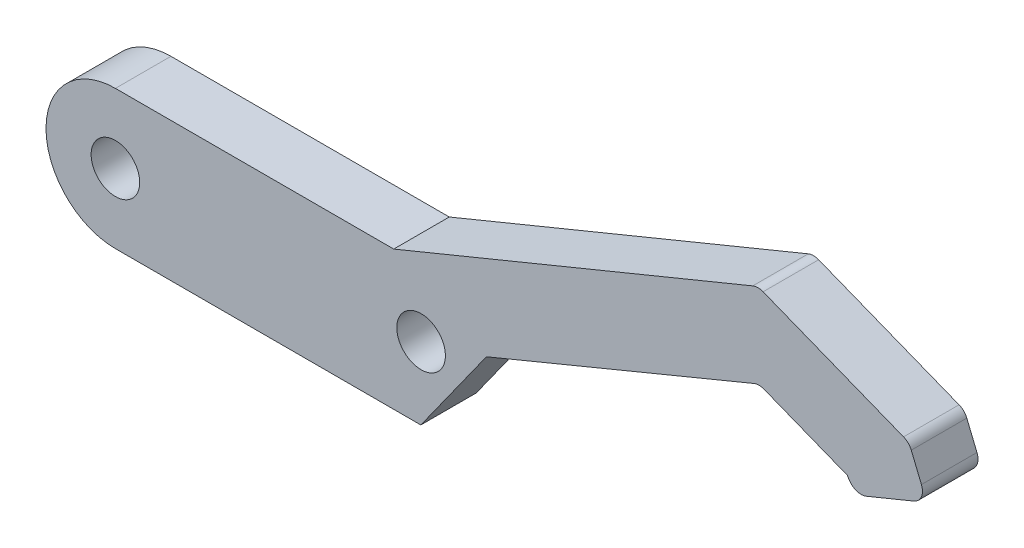
ISO-10303-21;
HEADER;
FILE_DESCRIPTION(('STEP AP214'),'2;1');
FILE_NAME('part.step','',(''),(''),'','','');
FILE_SCHEMA(('AUTOMOTIVE_DESIGN { 1 0 10303 214 1 1 1 1 }'));
ENDSEC;
DATA;
#1=APPLICATION_CONTEXT('core data for automotive mechanical design processes');
#2=APPLICATION_PROTOCOL_DEFINITION('international standard','automotive_design',2000,#1);
#3=PRODUCT_CONTEXT('',#1,'mechanical');
#4=PRODUCT('Part','Part','',(#3));
#5=PRODUCT_RELATED_PRODUCT_CATEGORY('part','',(#4));
#6=PRODUCT_DEFINITION_FORMATION('','',#4);
#7=PRODUCT_DEFINITION_CONTEXT('part definition',#1,'design');
#8=PRODUCT_DEFINITION('design','',#6,#7);
#9=PRODUCT_DEFINITION_SHAPE('','',#8);
#10=(LENGTH_UNIT() NAMED_UNIT(*) SI_UNIT(.MILLI.,.METRE.));
#11=(NAMED_UNIT(*) PLANE_ANGLE_UNIT() SI_UNIT($,.RADIAN.));
#12=(NAMED_UNIT(*) SI_UNIT($,.STERADIAN.) SOLID_ANGLE_UNIT());
#13=UNCERTAINTY_MEASURE_WITH_UNIT(LENGTH_MEASURE(1.E-05),#10,'distance_accuracy_value','');
#14=(GEOMETRIC_REPRESENTATION_CONTEXT(3) GLOBAL_UNCERTAINTY_ASSIGNED_CONTEXT((#13)) GLOBAL_UNIT_ASSIGNED_CONTEXT((#10,
#11,#12)) REPRESENTATION_CONTEXT('',''));
#15=CARTESIAN_POINT('',(0.,0.,0.));
#16=DIRECTION('',(0.,0.,1.));
#17=DIRECTION('',(1.,0.,0.));
#18=AXIS2_PLACEMENT_3D('',#15,#16,#17);
#19=CARTESIAN_POINT('',(16.934362430617,-12.0934009893302,4.));
#20=DIRECTION('',(0.81379193013563,-0.581156342515615,0.));
#21=DIRECTION('',(0.581156342515615,0.81379193013563,0.));
#22=AXIS2_PLACEMENT_3D('',#19,#20,#21);
#23=PLANE('',#22);
#24=DIRECTION('',(-0.581156342515615,-0.81379193013563,0.));
#25=VECTOR('',#24,1.);
#26=CARTESIAN_POINT('',(16.934362430617,-12.0934009893302,0.));
#27=LINE('',#26,#25);
#28=CARTESIAN_POINT('',(26.7294034168635,1.62257305553869,0.));
#29=VERTEX_POINT('',#28);
#30=CARTESIAN_POINT('',(22.,-5.,0.));
#31=VERTEX_POINT('',#30);
#32=EDGE_CURVE('E169',#29,#31,#27,.T.);
#33=ORIENTED_EDGE('',*,*,#32,.F.);
#34=DIRECTION('',(0.,0.,-1.));
#35=VECTOR('',#34,1.);
#36=CARTESIAN_POINT('',(26.7294034168635,1.62257305553869,4.));
#37=LINE('',#36,#35);
#38=CARTESIAN_POINT('',(26.7294034168635,1.62257305553869,4.));
#39=VERTEX_POINT('',#38);
#40=EDGE_CURVE('E157',#39,#29,#37,.T.);
#41=ORIENTED_EDGE('',*,*,#40,.F.);
#42=DIRECTION('',(-0.581156342515615,-0.81379193013563,0.));
#43=VECTOR('',#42,1.);
#44=CARTESIAN_POINT('',(16.934362430617,-12.0934009893302,4.));
#45=LINE('',#44,#43);
#46=CARTESIAN_POINT('',(22.,-5.,4.));
#47=VERTEX_POINT('',#46);
#48=EDGE_CURVE('E164',#39,#47,#45,.T.);
#49=ORIENTED_EDGE('',*,*,#48,.T.);
#50=DIRECTION('',(0.,0.,-1.));
#51=VECTOR('',#50,1.);
#52=CARTESIAN_POINT('',(22.,-5.,4.));
#53=LINE('',#52,#51);
#54=EDGE_CURVE('E207',#47,#31,#53,.T.);
#55=ORIENTED_EDGE('',*,*,#54,.T.);
#56=EDGE_LOOP('',(#33,#41,#49,#55));
#57=FACE_BOUND('',#56,.T.);
#58=ADVANCED_FACE('F35',(#57),#23,.T.);
#59=CARTESIAN_POINT('',(3.32722644666791,-8.05000728041563,4.));
#60=DIRECTION('',(0.381978201381876,-0.924171333503192,0.));
#61=DIRECTION('',(0.924171333503192,0.381978201381876,0.));
#62=AXIS2_PLACEMENT_3D('',#59,#60,#61);
#63=PLANE('',#62);
#64=DIRECTION('',(-0.924171333503192,-0.381978201381876,0.));
#65=VECTOR('',#64,1.);
#66=CARTESIAN_POINT('',(3.32722644666791,-8.05000728041563,0.));
#67=LINE('',#66,#65);
#68=CARTESIAN_POINT('',(45.9854130845709,9.58146084183411,0.));
#69=VERTEX_POINT('',#68);
#70=EDGE_CURVE('E209',#69,#29,#67,.T.);
#71=ORIENTED_EDGE('',*,*,#70,.F.);
#72=DIRECTION('',(0.,0.,-1.));
#73=VECTOR('',#72,1.);
#74=CARTESIAN_POINT('',(45.9854130845709,9.5814608418341,4.));
#75=LINE('',#74,#73);
#76=CARTESIAN_POINT('',(45.9854130845709,9.58146084183411,4.));
#77=VERTEX_POINT('',#76);
#78=EDGE_CURVE('E160',#69,#77,#75,.F.);
#79=ORIENTED_EDGE('',*,*,#78,.T.);
#80=DIRECTION('',(-0.924171333503192,-0.381978201381876,0.));
#81=VECTOR('',#80,1.);
#82=CARTESIAN_POINT('',(3.32722644666791,-8.05000728041563,4.));
#83=LINE('',#82,#81);
#84=EDGE_CURVE('E153',#77,#39,#83,.T.);
#85=ORIENTED_EDGE('',*,*,#84,.T.);
#86=ORIENTED_EDGE('',*,*,#40,.T.);
#87=EDGE_LOOP('',(#71,#79,#85,#86));
#88=FACE_BOUND('',#87,.T.);
#89=ADVANCED_FACE('F156',(#88),#63,.T.);
#90=CARTESIAN_POINT('',(9.576537290638,24.2571481525365,4.));
#91=DIRECTION('',(-0.367211229440493,-0.930137577443682,0.));
#92=DIRECTION('',(0.930137577443682,-0.367211229440493,0.));
#93=AXIS2_PLACEMENT_3D('',#90,#91,#92);
#94=PLANE('',#93);
#95=DIRECTION('',(-0.930137577443682,0.367211229440493,0.));
#96=VECTOR('',#95,1.);
#97=CARTESIAN_POINT('',(9.576537290638,24.2571481525365,4.));
#98=LINE('',#97,#96);
#99=CARTESIAN_POINT('',(52.7187610514864,7.22492688527212,4.));
#100=VERTEX_POINT('',#99);
#101=CARTESIAN_POINT('',(46.7346025153933,9.58742708577459,4.));
#102=VERTEX_POINT('',#101);
#103=EDGE_CURVE('E163',#100,#102,#98,.T.);
#104=ORIENTED_EDGE('',*,*,#103,.T.);
#105=DIRECTION('',(0.,0.,-1.));
#106=VECTOR('',#105,1.);
#107=CARTESIAN_POINT('',(46.7346025153933,9.5874270857746,0.));
#108=LINE('',#107,#106);
#109=CARTESIAN_POINT('',(46.7346025153933,9.58742708577459,0.));
#110=VERTEX_POINT('',#109);
#111=EDGE_CURVE('E170',#102,#110,#108,.T.);
#112=ORIENTED_EDGE('',*,*,#111,.T.);
#113=DIRECTION('',(-0.930137577443682,0.367211229440493,0.));
#114=VECTOR('',#113,1.);
#115=CARTESIAN_POINT('',(9.576537290638,24.2571481525365,0.));
#116=LINE('',#115,#114);
#117=CARTESIAN_POINT('',(52.7187610514864,7.22492688527212,0.));
#118=VERTEX_POINT('',#117);
#119=EDGE_CURVE('E211',#118,#110,#116,.T.);
#120=ORIENTED_EDGE('',*,*,#119,.F.);
#121=DIRECTION('',(0.,0.,-1.));
#122=VECTOR('',#121,1.);
#123=CARTESIAN_POINT('',(52.7187610514864,7.22492688527212,4.));
#124=LINE('',#123,#122);
#125=EDGE_CURVE('E171',#100,#118,#124,.T.);
#126=ORIENTED_EDGE('',*,*,#125,.F.);
#127=EDGE_LOOP('',(#104,#112,#120,#126));
#128=FACE_BOUND('',#127,.T.);
#129=ADVANCED_FACE('F316',(#128),#94,.T.);
#130=CARTESIAN_POINT('',(40.3231703772144,26.2593044322589,4.));
#131=DIRECTION('',(0.837975692706987,0.545707557609609,0.));
#132=DIRECTION('',(-0.545707557609609,0.837975692706987,0.));
#133=AXIS2_PLACEMENT_3D('',#130,#131,#132);
#134=PLANE('',#133);
#135=DIRECTION('',(0.545707557609609,-0.837975692706987,0.));
#136=VECTOR('',#135,1.);
#137=CARTESIAN_POINT('',(40.3231703772144,26.2593044322589,0.));
#138=LINE('',#137,#136);
#139=CARTESIAN_POINT('',(52.8776413501902,6.98095403478241,0.));
#140=VERTEX_POINT('',#139);
#141=EDGE_CURVE('E214',#118,#140,#138,.T.);
#142=ORIENTED_EDGE('',*,*,#141,.T.);
#143=DIRECTION('',(0.,0.,-1.));
#144=VECTOR('',#143,1.);
#145=CARTESIAN_POINT('',(52.8776413501902,6.98095403478241,4.));
#146=LINE('',#145,#144);
#147=CARTESIAN_POINT('',(52.8776413501902,6.98095403478241,4.));
#148=VERTEX_POINT('',#147);
#149=EDGE_CURVE('E254',#140,#148,#146,.F.);
#150=ORIENTED_EDGE('',*,*,#149,.T.);
#151=DIRECTION('',(0.545707557609609,-0.837975692706987,0.));
#152=VECTOR('',#151,1.);
#153=CARTESIAN_POINT('',(40.3231703772144,26.2593044322589,4.));
#154=LINE('',#153,#152);
#155=EDGE_CURVE('E188',#100,#148,#154,.T.);
#156=ORIENTED_EDGE('',*,*,#155,.F.);
#157=ORIENTED_EDGE('',*,*,#125,.T.);
#158=EDGE_LOOP('',(#142,#150,#156,#157));
#159=FACE_BOUND('',#158,.T.);
#160=ADVANCED_FACE('F363',(#159),#134,.F.);
#161=CARTESIAN_POINT('',(5.50044882078671,-13.3782141251102,4.));
#162=DIRECTION('',(0.380263412733206,-0.924878228166549,0.));
#163=DIRECTION('',(0.924878228166549,0.380263412733206,0.));
#164=AXIS2_PLACEMENT_3D('',#161,#162,#163);
#165=PLANE('',#164);
#166=DIRECTION('',(-0.924878228166549,-0.380263412733206,0.));
#167=VECTOR('',#166,1.);
#168=CARTESIAN_POINT('',(5.50044882078671,-13.3782141251102,4.));
#169=LINE('',#168,#167);
#170=CARTESIAN_POINT('',(57.5184576308977,8.0089749678055,4.));
#171=VERTEX_POINT('',#170);
#172=CARTESIAN_POINT('',(54.0958804556304,6.60178336422548,4.));
#173=VERTEX_POINT('',#172);
#174=EDGE_CURVE('E191',#171,#173,#169,.T.);
#175=ORIENTED_EDGE('',*,*,#174,.T.);
#176=DIRECTION('',(0.,0.,-1.));
#177=VECTOR('',#176,1.);
#178=CARTESIAN_POINT('',(54.0958804556304,6.60178336422547,0.));
#179=LINE('',#178,#177);
#180=CARTESIAN_POINT('',(54.0958804556304,6.60178336422548,0.));
#181=VERTEX_POINT('',#180);
#182=EDGE_CURVE('E247',#173,#181,#179,.T.);
#183=ORIENTED_EDGE('',*,*,#182,.T.);
#184=DIRECTION('',(-0.924878228166549,-0.380263412733206,0.));
#185=VECTOR('',#184,1.);
#186=CARTESIAN_POINT('',(5.50044882078671,-13.3782141251102,0.));
#187=LINE('',#186,#185);
#188=CARTESIAN_POINT('',(57.5184576308977,8.0089749678055,0.));
#189=VERTEX_POINT('',#188);
#190=EDGE_CURVE('E217',#189,#181,#187,.T.);
#191=ORIENTED_EDGE('',*,*,#190,.F.);
#192=DIRECTION('',(0.,0.,-1.));
#193=VECTOR('',#192,1.);
#194=CARTESIAN_POINT('',(57.5184576308977,8.0089749678055,4.));
#195=LINE('',#194,#193);
#196=EDGE_CURVE('E245',#189,#171,#195,.F.);
#197=ORIENTED_EDGE('',*,*,#196,.T.);
#198=EDGE_LOOP('',(#175,#183,#191,#197));
#199=FACE_BOUND('',#198,.T.);
#200=ADVANCED_FACE('F370',(#199),#165,.T.);
#201=CARTESIAN_POINT('',(52.9428870382775,21.767452505649,4.));
#202=DIRECTION('',(0.924878228166549,0.380263412733207,0.));
#203=DIRECTION('',(-0.380263412733207,0.924878228166549,0.));
#204=AXIS2_PLACEMENT_3D('',#201,#202,#203);
#205=PLANE('',#204);
#206=DIRECTION('',(0.380263412733207,-0.924878228166549,0.));
#207=VECTOR('',#206,1.);
#208=CARTESIAN_POINT('',(52.9428870382775,21.767452505649,0.));
#209=LINE('',#208,#207);
#210=CARTESIAN_POINT('',(57.3308590728285,11.0950089713373,0.));
#211=VERTEX_POINT('',#210);
#212=CARTESIAN_POINT('',(58.0630724463311,9.31411660870525,0.));
#213=VERTEX_POINT('',#212);
#214=EDGE_CURVE('E220',#211,#213,#209,.T.);
#215=ORIENTED_EDGE('',*,*,#214,.F.);
#216=DIRECTION('',(0.,0.,-1.));
#217=VECTOR('',#216,1.);
#218=CARTESIAN_POINT('',(57.3308590728285,11.0950089713373,4.));
#219=LINE('',#218,#217);
#220=CARTESIAN_POINT('',(57.3308590728285,11.0950089713373,4.));
#221=VERTEX_POINT('',#220);
#222=EDGE_CURVE('E60',#211,#221,#219,.F.);
#223=ORIENTED_EDGE('',*,*,#222,.T.);
#224=DIRECTION('',(0.380263412733207,-0.924878228166549,0.));
#225=VECTOR('',#224,1.);
#226=CARTESIAN_POINT('',(52.9428870382775,21.767452505649,4.));
#227=LINE('',#226,#225);
#228=CARTESIAN_POINT('',(58.0630724463311,9.31411660870525,4.));
#229=VERTEX_POINT('',#228);
#230=EDGE_CURVE('E194',#221,#229,#227,.T.);
#231=ORIENTED_EDGE('',*,*,#230,.T.);
#232=DIRECTION('',(0.,0.,-1.));
#233=VECTOR('',#232,1.);
#234=CARTESIAN_POINT('',(58.0630724463311,9.31411660870525,4.));
#235=LINE('',#234,#233);
#236=EDGE_CURVE('E261',#229,#213,#235,.T.);
#237=ORIENTED_EDGE('',*,*,#236,.T.);
#238=EDGE_LOOP('',(#215,#223,#231,#237));
#239=FACE_BOUND('',#238,.T.);
#240=ADVANCED_FACE('F375',(#239),#205,.T.);
#241=CARTESIAN_POINT('',(11.6329201755047,29.465918586221,4.));
#242=DIRECTION('',(0.367211229440492,0.930137577443683,0.));
#243=DIRECTION('',(-0.930137577443683,0.367211229440492,0.));
#244=AXIS2_PLACEMENT_3D('',#241,#242,#243);
#245=PLANE('',#244);
#246=DIRECTION('',(0.930137577443683,-0.367211229440492,0.));
#247=VECTOR('',#246,1.);
#248=CARTESIAN_POINT('',(11.6329201755047,29.465918586221,4.));
#249=LINE('',#248,#247);
#250=CARTESIAN_POINT('',(46.6585920111069,15.6380501841303,4.));
#251=VERTEX_POINT('',#250);
#252=CARTESIAN_POINT('',(56.7731920741024,11.6448831360478,4.));
#253=VERTEX_POINT('',#252);
#254=EDGE_CURVE('E196',#251,#253,#249,.T.);
#255=ORIENTED_EDGE('',*,*,#254,.T.);
#256=DIRECTION('',(0.,0.,-1.));
#257=VECTOR('',#256,1.);
#258=CARTESIAN_POINT('',(56.7731920741024,11.6448831360478,4.));
#259=LINE('',#258,#257);
#260=CARTESIAN_POINT('',(56.7731920741024,11.6448831360478,0.));
#261=VERTEX_POINT('',#260);
#262=EDGE_CURVE('E270',#253,#261,#259,.T.);
#263=ORIENTED_EDGE('',*,*,#262,.T.);
#264=DIRECTION('',(0.930137577443683,-0.367211229440492,0.));
#265=VECTOR('',#264,1.);
#266=CARTESIAN_POINT('',(11.6329201755047,29.465918586221,0.));
#267=LINE('',#266,#265);
#268=CARTESIAN_POINT('',(46.6585920111069,15.6380501841303,0.));
#269=VERTEX_POINT('',#268);
#270=EDGE_CURVE('E222',#269,#261,#267,.T.);
#271=ORIENTED_EDGE('',*,*,#270,.F.);
#272=DIRECTION('',(0.,0.,-1.));
#273=VECTOR('',#272,1.);
#274=CARTESIAN_POINT('',(46.6585920111069,15.6380501841303,4.));
#275=LINE('',#274,#273);
#276=EDGE_CURVE('E268',#269,#251,#275,.F.);
#277=ORIENTED_EDGE('',*,*,#276,.T.);
#278=EDGE_LOOP('',(#255,#263,#271,#277));
#279=FACE_BOUND('',#278,.T.);
#280=ADVANCED_FACE('F340',(#279),#245,.T.);
#281=CARTESIAN_POINT('',(1.14074851739701,-2.77453321099285,4.));
#282=DIRECTION('',(-0.380263412733207,0.924878228166549,0.));
#283=DIRECTION('',(-0.924878228166549,-0.380263412733207,0.));
#284=AXIS2_PLACEMENT_3D('',#281,#282,#283);
#285=PLANE('',#284);
#286=DIRECTION('',(0.924878228166549,0.380263412733207,0.));
#287=VECTOR('',#286,1.);
#288=CARTESIAN_POINT('',(1.14074851739701,-2.77453321099285,4.));
#289=LINE('',#288,#287);
#290=CARTESIAN_POINT('',(20.05,5.,4.));
#291=VERTEX_POINT('',#290);
#292=CARTESIAN_POINT('',(45.9111173689332,15.6327908348532,4.));
#293=VERTEX_POINT('',#292);
#294=EDGE_CURVE('E199',#291,#293,#289,.T.);
#295=ORIENTED_EDGE('',*,*,#294,.T.);
#296=DIRECTION('',(0.,0.,-1.));
#297=VECTOR('',#296,1.);
#298=CARTESIAN_POINT('',(45.9111173689332,15.6327908348532,4.));
#299=LINE('',#298,#297);
#300=CARTESIAN_POINT('',(45.9111173689332,15.6327908348532,0.));
#301=VERTEX_POINT('',#300);
#302=EDGE_CURVE('E11',#293,#301,#299,.T.);
#303=ORIENTED_EDGE('',*,*,#302,.T.);
#304=DIRECTION('',(0.924878228166549,0.380263412733207,0.));
#305=VECTOR('',#304,1.);
#306=CARTESIAN_POINT('',(1.14074851739701,-2.77453321099285,0.));
#307=LINE('',#306,#305);
#308=CARTESIAN_POINT('',(20.05,5.,0.));
#309=VERTEX_POINT('',#308);
#310=EDGE_CURVE('E225',#309,#301,#307,.T.);
#311=ORIENTED_EDGE('',*,*,#310,.F.);
#312=DIRECTION('',(0.,0.,-1.));
#313=VECTOR('',#312,1.);
#314=CARTESIAN_POINT('',(20.05,5.,4.));
#315=LINE('',#314,#313);
#316=EDGE_CURVE('E239',#291,#309,#315,.T.);
#317=ORIENTED_EDGE('',*,*,#316,.F.);
#318=EDGE_LOOP('',(#295,#303,#311,#317));
#319=FACE_BOUND('',#318,.T.);
#320=ADVANCED_FACE('F346',(#319),#285,.T.);
#321=CARTESIAN_POINT('',(0.,5.,4.));
#322=DIRECTION('',(0.,1.,0.));
#323=DIRECTION('',(-1.,0.,0.));
#324=AXIS2_PLACEMENT_3D('',#321,#322,#323);
#325=PLANE('',#324);
#326=DIRECTION('',(1.,0.,0.));
#327=VECTOR('',#326,1.);
#328=CARTESIAN_POINT('',(0.,5.,0.));
#329=LINE('',#328,#327);
#330=CARTESIAN_POINT('',(0.,5.,0.));
#331=VERTEX_POINT('',#330);
#332=EDGE_CURVE('E228',#331,#309,#329,.T.);
#333=ORIENTED_EDGE('',*,*,#332,.F.);
#334=DIRECTION('',(0.,0.,-1.));
#335=VECTOR('',#334,1.);
#336=CARTESIAN_POINT('',(0.,5.,4.));
#337=LINE('',#336,#335);
#338=CARTESIAN_POINT('',(0.,5.,4.));
#339=VERTEX_POINT('',#338);
#340=EDGE_CURVE('E237',#339,#331,#337,.T.);
#341=ORIENTED_EDGE('',*,*,#340,.F.);
#342=DIRECTION('',(1.,0.,0.));
#343=VECTOR('',#342,1.);
#344=CARTESIAN_POINT('',(0.,5.,4.));
#345=LINE('',#344,#343);
#346=EDGE_CURVE('E201',#339,#291,#345,.T.);
#347=ORIENTED_EDGE('',*,*,#346,.T.);
#348=ORIENTED_EDGE('',*,*,#316,.T.);
#349=EDGE_LOOP('',(#333,#341,#347,#348));
#350=FACE_BOUND('',#349,.T.);
#351=ADVANCED_FACE('F351',(#350),#325,.T.);
#352=CARTESIAN_POINT('',(0.,0.,4.));
#353=DIRECTION('',(0.,0.,-1.));
#354=DIRECTION('',(-1.,0.,0.));
#355=AXIS2_PLACEMENT_3D('',#352,#353,#354);
#356=CYLINDRICAL_SURFACE('',#355,5.);
#357=CARTESIAN_POINT('',(0.,0.,0.));
#358=DIRECTION('',(0.,0.,1.));
#359=DIRECTION('',(1.,0.,0.));
#360=AXIS2_PLACEMENT_3D('',#357,#358,#359);
#361=CIRCLE('',#360,5.);
#362=CARTESIAN_POINT('',(0.,-5.,0.));
#363=VERTEX_POINT('',#362);
#364=EDGE_CURVE('E180',#331,#363,#361,.T.);
#365=ORIENTED_EDGE('',*,*,#364,.T.);
#366=DIRECTION('',(0.,0.,-1.));
#367=VECTOR('',#366,1.);
#368=CARTESIAN_POINT('',(0.,-5.,4.));
#369=LINE('',#368,#367);
#370=CARTESIAN_POINT('',(0.,-5.,4.));
#371=VERTEX_POINT('',#370);
#372=EDGE_CURVE('E234',#371,#363,#369,.T.);
#373=ORIENTED_EDGE('',*,*,#372,.F.);
#374=CARTESIAN_POINT('',(0.,0.,4.));
#375=DIRECTION('',(0.,0.,1.));
#376=DIRECTION('',(1.,0.,0.));
#377=AXIS2_PLACEMENT_3D('',#374,#375,#376);
#378=CIRCLE('',#377,5.);
#379=EDGE_CURVE('E204',#339,#371,#378,.T.);
#380=ORIENTED_EDGE('',*,*,#379,.F.);
#381=ORIENTED_EDGE('',*,*,#340,.T.);
#382=EDGE_LOOP('',(#365,#373,#380,#381));
#383=FACE_BOUND('',#382,.T.);
#384=ADVANCED_FACE('F307',(#383),#356,.T.);
#385=CARTESIAN_POINT('',(0.,-5.,4.));
#386=DIRECTION('',(0.,1.,0.));
#387=DIRECTION('',(-1.,0.,0.));
#388=AXIS2_PLACEMENT_3D('',#385,#386,#387);
#389=PLANE('',#388);
#390=DIRECTION('',(1.,0.,0.));
#391=VECTOR('',#390,1.);
#392=CARTESIAN_POINT('',(0.,-5.,0.));
#393=LINE('',#392,#391);
#394=EDGE_CURVE('E177',#363,#31,#393,.T.);
#395=ORIENTED_EDGE('',*,*,#394,.T.);
#396=ORIENTED_EDGE('',*,*,#54,.F.);
#397=DIRECTION('',(1.,0.,0.));
#398=VECTOR('',#397,1.);
#399=CARTESIAN_POINT('',(0.,-5.,4.));
#400=LINE('',#399,#398);
#401=EDGE_CURVE('E175',#371,#47,#400,.T.);
#402=ORIENTED_EDGE('',*,*,#401,.F.);
#403=ORIENTED_EDGE('',*,*,#372,.T.);
#404=EDGE_LOOP('',(#395,#396,#402,#403));
#405=FACE_BOUND('',#404,.T.);
#406=ADVANCED_FACE('F296',(#405),#389,.F.);
#407=CARTESIAN_POINT('',(0.,0.,4.));
#408=DIRECTION('',(0.,0.,1.));
#409=DIRECTION('',(1.,0.,0.));
#410=AXIS2_PLACEMENT_3D('',#407,#408,#409);
#411=PLANE('',#410);
#412=CARTESIAN_POINT('',(22.0207052746916,0.206842568432915,4.));
#413=DIRECTION('',(0.,0.,1.));
#414=DIRECTION('',(1.,0.,0.));
#415=AXIS2_PLACEMENT_3D('',#412,#413,#414);
#416=CIRCLE('',#415,1.75);
#417=CARTESIAN_POINT('',(23.7707052746916,0.206842568432915,4.));
#418=VERTEX_POINT('',#417);
#419=EDGE_CURVE('E281',#418,#418,#416,.T.);
#420=ORIENTED_EDGE('',*,*,#419,.F.);
#421=EDGE_LOOP('',(#420));
#422=FACE_BOUND('',#421,.T.);
#423=CARTESIAN_POINT('',(0.,0.,4.));
#424=DIRECTION('',(0.,0.,1.));
#425=DIRECTION('',(1.,0.,0.));
#426=AXIS2_PLACEMENT_3D('',#423,#424,#425);
#427=CIRCLE('',#426,1.75);
#428=CARTESIAN_POINT('',(1.75,0.,4.));
#429=VERTEX_POINT('',#428);
#430=EDGE_CURVE('E183',#429,#429,#427,.T.);
#431=ORIENTED_EDGE('',*,*,#430,.F.);
#432=EDGE_LOOP('',(#431));
#433=FACE_BOUND('',#432,.T.);
#434=ORIENTED_EDGE('',*,*,#230,.F.);
#435=CARTESIAN_POINT('',(56.4059808446619,10.7147455586041,4.));
#436=DIRECTION('',(0.,0.,1.));
#437=DIRECTION('',(1.,0.,0.));
#438=AXIS2_PLACEMENT_3D('',#435,#436,#437);
#439=CIRCLE('',#438,1.);
#440=EDGE_CURVE('E44',#221,#253,#439,.T.);
#441=ORIENTED_EDGE('',*,*,#440,.T.);
#442=ORIENTED_EDGE('',*,*,#254,.F.);
#443=CARTESIAN_POINT('',(46.2913807816664,14.7079126066866,4.));
#444=DIRECTION('',(0.,0.,1.));
#445=DIRECTION('',(1.,0.,0.));
#446=AXIS2_PLACEMENT_3D('',#443,#444,#445);
#447=CIRCLE('',#446,1.);
#448=EDGE_CURVE('E52',#251,#293,#447,.T.);
#449=ORIENTED_EDGE('',*,*,#448,.T.);
#450=ORIENTED_EDGE('',*,*,#294,.F.);
#451=ORIENTED_EDGE('',*,*,#346,.F.);
#452=ORIENTED_EDGE('',*,*,#379,.T.);
#453=ORIENTED_EDGE('',*,*,#401,.T.);
#454=ORIENTED_EDGE('',*,*,#48,.F.);
#455=ORIENTED_EDGE('',*,*,#84,.F.);
#456=CARTESIAN_POINT('',(46.3673912859528,8.65728950833092,4.));
#457=DIRECTION('',(0.,0.,1.));
#458=DIRECTION('',(1.,0.,0.));
#459=AXIS2_PLACEMENT_3D('',#456,#457,#458);
#460=CIRCLE('',#459,1.);
#461=EDGE_CURVE('E266',#77,#102,#460,.F.);
#462=ORIENTED_EDGE('',*,*,#461,.T.);
#463=ORIENTED_EDGE('',*,*,#103,.F.);
#464=ORIENTED_EDGE('',*,*,#155,.T.);
#465=CARTESIAN_POINT('',(53.7156170428972,7.52666159239202,4.));
#466=DIRECTION('',(0.,0.,1.));
#467=DIRECTION('',(1.,0.,0.));
#468=AXIS2_PLACEMENT_3D('',#465,#466,#467);
#469=CIRCLE('',#468,1.);
#470=EDGE_CURVE('E259',#148,#173,#469,.T.);
#471=ORIENTED_EDGE('',*,*,#470,.T.);
#472=ORIENTED_EDGE('',*,*,#174,.F.);
#473=CARTESIAN_POINT('',(57.1381942181645,8.93385319597205,4.));
#474=DIRECTION('',(0.,0.,1.));
#475=DIRECTION('',(1.,0.,0.));
#476=AXIS2_PLACEMENT_3D('',#473,#474,#475);
#477=CIRCLE('',#476,1.);
#478=EDGE_CURVE('E256',#171,#229,#477,.T.);
#479=ORIENTED_EDGE('',*,*,#478,.T.);
#480=EDGE_LOOP('',(#434,#441,#442,#449,#450,#451,#452,#453,#454,#455,#462,#463,#464,#471,#472,#479));
#481=FACE_BOUND('',#480,.T.);
#482=ADVANCED_FACE('F173',(#422,#433,#481),#411,.T.);
#483=CARTESIAN_POINT('',(0.,0.,0.));
#484=DIRECTION('',(0.,0.,1.));
#485=DIRECTION('',(1.,0.,0.));
#486=AXIS2_PLACEMENT_3D('',#483,#484,#485);
#487=PLANE('',#486);
#488=CARTESIAN_POINT('',(22.0207052746916,0.206842568432915,0.));
#489=DIRECTION('',(0.,0.,1.));
#490=DIRECTION('',(1.,0.,0.));
#491=AXIS2_PLACEMENT_3D('',#488,#489,#490);
#492=CIRCLE('',#491,1.75);
#493=CARTESIAN_POINT('',(23.7707052746916,0.206842568432915,0.));
#494=VERTEX_POINT('',#493);
#495=EDGE_CURVE('E39',#494,#494,#492,.T.);
#496=ORIENTED_EDGE('',*,*,#495,.T.);
#497=EDGE_LOOP('',(#496));
#498=FACE_BOUND('',#497,.T.);
#499=CARTESIAN_POINT('',(0.,0.,0.));
#500=DIRECTION('',(0.,0.,1.));
#501=DIRECTION('',(1.,0.,0.));
#502=AXIS2_PLACEMENT_3D('',#499,#500,#501);
#503=CIRCLE('',#502,1.75);
#504=CARTESIAN_POINT('',(1.75,0.,0.));
#505=VERTEX_POINT('',#504);
#506=EDGE_CURVE('E279',#505,#505,#503,.T.);
#507=ORIENTED_EDGE('',*,*,#506,.T.);
#508=EDGE_LOOP('',(#507));
#509=FACE_BOUND('',#508,.T.);
#510=ORIENTED_EDGE('',*,*,#270,.T.);
#511=CARTESIAN_POINT('',(56.4059808446619,10.7147455586041,0.));
#512=DIRECTION('',(0.,0.,1.));
#513=DIRECTION('',(1.,0.,0.));
#514=AXIS2_PLACEMENT_3D('',#511,#512,#513);
#515=CIRCLE('',#514,1.);
#516=EDGE_CURVE('E275',#261,#211,#515,.F.);
#517=ORIENTED_EDGE('',*,*,#516,.T.);
#518=ORIENTED_EDGE('',*,*,#214,.T.);
#519=CARTESIAN_POINT('',(57.1381942181645,8.93385319597205,0.));
#520=DIRECTION('',(0.,0.,1.));
#521=DIRECTION('',(1.,0.,0.));
#522=AXIS2_PLACEMENT_3D('',#519,#520,#521);
#523=CIRCLE('',#522,1.);
#524=EDGE_CURVE('E250',#213,#189,#523,.F.);
#525=ORIENTED_EDGE('',*,*,#524,.T.);
#526=ORIENTED_EDGE('',*,*,#190,.T.);
#527=CARTESIAN_POINT('',(53.7156170428972,7.52666159239202,0.));
#528=DIRECTION('',(0.,0.,1.));
#529=DIRECTION('',(1.,0.,0.));
#530=AXIS2_PLACEMENT_3D('',#527,#528,#529);
#531=CIRCLE('',#530,1.);
#532=EDGE_CURVE('E252',#181,#140,#531,.F.);
#533=ORIENTED_EDGE('',*,*,#532,.T.);
#534=ORIENTED_EDGE('',*,*,#141,.F.);
#535=ORIENTED_EDGE('',*,*,#119,.T.);
#536=CARTESIAN_POINT('',(46.3673912859528,8.65728950833092,0.));
#537=DIRECTION('',(0.,0.,1.));
#538=DIRECTION('',(1.,0.,0.));
#539=AXIS2_PLACEMENT_3D('',#536,#537,#538);
#540=CIRCLE('',#539,1.);
#541=EDGE_CURVE('E264',#110,#69,#540,.T.);
#542=ORIENTED_EDGE('',*,*,#541,.T.);
#543=ORIENTED_EDGE('',*,*,#70,.T.);
#544=ORIENTED_EDGE('',*,*,#32,.T.);
#545=ORIENTED_EDGE('',*,*,#394,.F.);
#546=ORIENTED_EDGE('',*,*,#364,.F.);
#547=ORIENTED_EDGE('',*,*,#332,.T.);
#548=ORIENTED_EDGE('',*,*,#310,.T.);
#549=CARTESIAN_POINT('',(46.2913807816664,14.7079126066866,0.));
#550=DIRECTION('',(0.,0.,1.));
#551=DIRECTION('',(1.,0.,0.));
#552=AXIS2_PLACEMENT_3D('',#549,#550,#551);
#553=CIRCLE('',#552,1.);
#554=EDGE_CURVE('E273',#301,#269,#553,.F.);
#555=ORIENTED_EDGE('',*,*,#554,.T.);
#556=EDGE_LOOP('',(#510,#517,#518,#525,#526,#533,#534,#535,#542,#543,#544,#545,#546,#547,#548,#555));
#557=FACE_BOUND('',#556,.T.);
#558=ADVANCED_FACE('F295',(#498,#509,#557),#487,.F.);
#559=CARTESIAN_POINT('',(46.3673912859528,8.65728950833092,4.));
#560=DIRECTION('',(0.,0.,1.));
#561=DIRECTION('',(1.,0.,0.));
#562=AXIS2_PLACEMENT_3D('',#559,#560,#561);
#563=CYLINDRICAL_SURFACE('',#562,1.);
#564=ORIENTED_EDGE('',*,*,#461,.F.);
#565=ORIENTED_EDGE('',*,*,#78,.F.);
#566=ORIENTED_EDGE('',*,*,#541,.F.);
#567=ORIENTED_EDGE('',*,*,#111,.F.);
#568=EDGE_LOOP('',(#564,#565,#566,#567));
#569=FACE_BOUND('',#568,.T.);
#570=ADVANCED_FACE('F303',(#569),#563,.F.);
#571=CARTESIAN_POINT('',(53.7156170428972,7.52666159239202,4.));
#572=DIRECTION('',(0.,0.,1.));
#573=DIRECTION('',(1.,0.,0.));
#574=AXIS2_PLACEMENT_3D('',#571,#572,#573);
#575=CYLINDRICAL_SURFACE('',#574,1.);
#576=ORIENTED_EDGE('',*,*,#470,.F.);
#577=ORIENTED_EDGE('',*,*,#149,.F.);
#578=ORIENTED_EDGE('',*,*,#532,.F.);
#579=ORIENTED_EDGE('',*,*,#182,.F.);
#580=EDGE_LOOP('',(#576,#577,#578,#579));
#581=FACE_BOUND('',#580,.T.);
#582=ADVANCED_FACE('F322',(#581),#575,.T.);
#583=CARTESIAN_POINT('',(57.1381942181645,8.93385319597205,4.));
#584=DIRECTION('',(0.,0.,-1.));
#585=DIRECTION('',(-1.,0.,0.));
#586=AXIS2_PLACEMENT_3D('',#583,#584,#585);
#587=CYLINDRICAL_SURFACE('',#586,1.);
#588=ORIENTED_EDGE('',*,*,#478,.F.);
#589=ORIENTED_EDGE('',*,*,#196,.F.);
#590=ORIENTED_EDGE('',*,*,#524,.F.);
#591=ORIENTED_EDGE('',*,*,#236,.F.);
#592=EDGE_LOOP('',(#588,#589,#590,#591));
#593=FACE_BOUND('',#592,.T.);
#594=ADVANCED_FACE('F326',(#593),#587,.T.);
#595=CARTESIAN_POINT('',(56.4059808446619,10.7147455586041,4.));
#596=DIRECTION('',(0.,0.,-1.));
#597=DIRECTION('',(-1.,0.,0.));
#598=AXIS2_PLACEMENT_3D('',#595,#596,#597);
#599=CYLINDRICAL_SURFACE('',#598,1.);
#600=ORIENTED_EDGE('',*,*,#440,.F.);
#601=ORIENTED_EDGE('',*,*,#222,.F.);
#602=ORIENTED_EDGE('',*,*,#516,.F.);
#603=ORIENTED_EDGE('',*,*,#262,.F.);
#604=EDGE_LOOP('',(#600,#601,#602,#603));
#605=FACE_BOUND('',#604,.T.);
#606=ADVANCED_FACE('F329',(#605),#599,.T.);
#607=CARTESIAN_POINT('',(46.2913807816664,14.7079126066866,4.));
#608=DIRECTION('',(0.,0.,-1.));
#609=DIRECTION('',(-1.,0.,0.));
#610=AXIS2_PLACEMENT_3D('',#607,#608,#609);
#611=CYLINDRICAL_SURFACE('',#610,1.);
#612=ORIENTED_EDGE('',*,*,#448,.F.);
#613=ORIENTED_EDGE('',*,*,#276,.F.);
#614=ORIENTED_EDGE('',*,*,#554,.F.);
#615=ORIENTED_EDGE('',*,*,#302,.F.);
#616=EDGE_LOOP('',(#612,#613,#614,#615));
#617=FACE_BOUND('',#616,.T.);
#618=ADVANCED_FACE('F37',(#617),#611,.T.);
#619=CARTESIAN_POINT('',(0.,0.,-6.));
#620=DIRECTION('',(0.,0.,1.));
#621=DIRECTION('',(1.,0.,0.));
#622=AXIS2_PLACEMENT_3D('',#619,#620,#621);
#623=CYLINDRICAL_SURFACE('',#622,1.75);
#624=ORIENTED_EDGE('',*,*,#430,.T.);
#625=EDGE_LOOP('',(#624));
#626=FACE_BOUND('',#625,.T.);
#627=ORIENTED_EDGE('',*,*,#506,.F.);
#628=EDGE_LOOP('',(#627));
#629=FACE_BOUND('',#628,.T.);
#630=ADVANCED_FACE('F291',(#626,#629),#623,.F.);
#631=CARTESIAN_POINT('',(22.0207052746916,0.206842568432915,-6.));
#632=DIRECTION('',(0.,0.,1.));
#633=DIRECTION('',(1.,0.,0.));
#634=AXIS2_PLACEMENT_3D('',#631,#632,#633);
#635=CYLINDRICAL_SURFACE('',#634,1.75);
#636=ORIENTED_EDGE('',*,*,#419,.T.);
#637=EDGE_LOOP('',(#636));
#638=FACE_BOUND('',#637,.T.);
#639=ORIENTED_EDGE('',*,*,#495,.F.);
#640=EDGE_LOOP('',(#639));
#641=FACE_BOUND('',#640,.T.);
#642=ADVANCED_FACE('F457',(#638,#641),#635,.F.);
#643=CLOSED_SHELL('',(#58,#89,#129,#160,#200,#240,#280,#320,#351,#384,#406,#482,#558,#570,#582,
#594,#606,#618,#630,#642));
#644=MANIFOLD_SOLID_BREP('B2',#643);
#645=ADVANCED_BREP_SHAPE_REPRESENTATION('',(#18,#644),#14);
#646=SHAPE_DEFINITION_REPRESENTATION(#9,#645);
ENDSEC;
END-ISO-10303-21;
